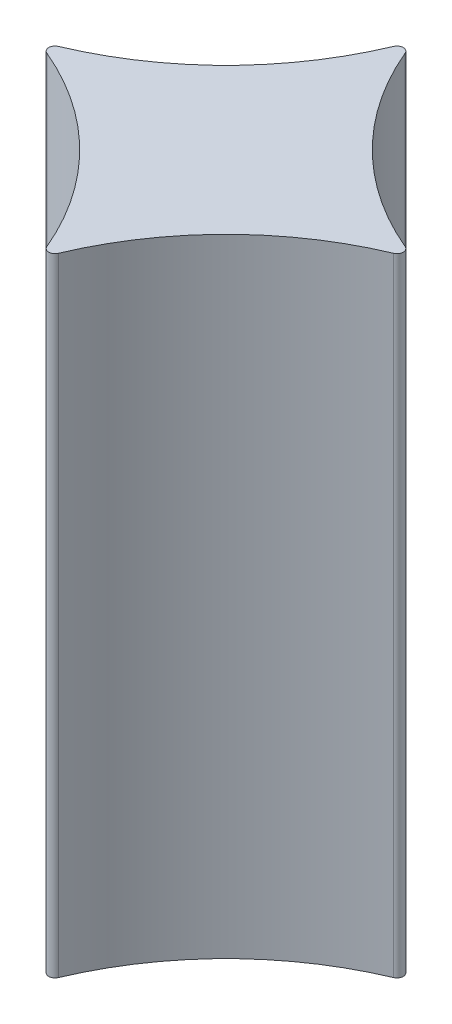
ISO-10303-21;
HEADER;
FILE_DESCRIPTION(('STEP AP214'),'2;1');
FILE_NAME('part.step','',(''),(''),'','','');
FILE_SCHEMA(('AUTOMOTIVE_DESIGN { 1 0 10303 214 1 1 1 1 }'));
ENDSEC;
DATA;
#1=APPLICATION_CONTEXT('core data for automotive mechanical design processes');
#2=APPLICATION_PROTOCOL_DEFINITION('international standard','automotive_design',2000,#1);
#3=PRODUCT_CONTEXT('',#1,'mechanical');
#4=PRODUCT('Part','Part','',(#3));
#5=PRODUCT_RELATED_PRODUCT_CATEGORY('part','',(#4));
#6=PRODUCT_DEFINITION_FORMATION('','',#4);
#7=PRODUCT_DEFINITION_CONTEXT('part definition',#1,'design');
#8=PRODUCT_DEFINITION('design','',#6,#7);
#9=PRODUCT_DEFINITION_SHAPE('','',#8);
#10=(LENGTH_UNIT() NAMED_UNIT(*) SI_UNIT(.MILLI.,.METRE.));
#11=(NAMED_UNIT(*) PLANE_ANGLE_UNIT() SI_UNIT($,.RADIAN.));
#12=(NAMED_UNIT(*) SI_UNIT($,.STERADIAN.) SOLID_ANGLE_UNIT());
#13=UNCERTAINTY_MEASURE_WITH_UNIT(LENGTH_MEASURE(1.E-05),#10,'distance_accuracy_value','');
#14=(GEOMETRIC_REPRESENTATION_CONTEXT(3) GLOBAL_UNCERTAINTY_ASSIGNED_CONTEXT((#13)) GLOBAL_UNIT_ASSIGNED_CONTEXT((#10,
#11,#12)) REPRESENTATION_CONTEXT('',''));
#15=CARTESIAN_POINT('',(0.,0.,0.));
#16=DIRECTION('',(0.,0.,1.));
#17=DIRECTION('',(1.,0.,0.));
#18=AXIS2_PLACEMENT_3D('',#15,#16,#17);
#19=CARTESIAN_POINT('',(2.72537547675906,10.,0.));
#20=DIRECTION('',(0.,-1.,0.));
#21=DIRECTION('',(0.,0.,-1.));
#22=AXIS2_PLACEMENT_3D('',#19,#20,#21);
#23=CYLINDRICAL_SURFACE('',#22,0.0999999999999999);
#24=CARTESIAN_POINT('',(2.72537547675906,0.,0.));
#25=DIRECTION('',(0.,1.,0.));
#26=DIRECTION('',(0.,0.,-1.));
#27=AXIS2_PLACEMENT_3D('',#24,#25,#26);
#28=CIRCLE('',#27,0.0999999999999999);
#29=CARTESIAN_POINT('',(2.7641242344445,0.,0.0921874925238529));
#30=VERTEX_POINT('',#29);
#31=CARTESIAN_POINT('',(2.76412423444449,0.,-0.0921874925238529));
#32=VERTEX_POINT('',#31);
#33=EDGE_CURVE('E140',#30,#32,#28,.T.);
#34=ORIENTED_EDGE('',*,*,#33,.T.);
#35=DIRECTION('',(0.,-1.,0.));
#36=VECTOR('',#35,1.);
#37=CARTESIAN_POINT('',(2.76412423444449,10.,-0.0921874925238529));
#38=LINE('',#37,#36);
#39=CARTESIAN_POINT('',(2.76412423444449,10.,-0.0921874925238529));
#40=VERTEX_POINT('',#39);
#41=EDGE_CURVE('E11',#40,#32,#38,.T.);
#42=ORIENTED_EDGE('',*,*,#41,.F.);
#43=CARTESIAN_POINT('',(2.72537547675906,10.,0.));
#44=DIRECTION('',(0.,1.,0.));
#45=DIRECTION('',(0.,0.,-1.));
#46=AXIS2_PLACEMENT_3D('',#43,#44,#45);
#47=CIRCLE('',#46,0.0999999999999999);
#48=CARTESIAN_POINT('',(2.7641242344445,10.,0.0921874925238529));
#49=VERTEX_POINT('',#48);
#50=EDGE_CURVE('E162',#49,#40,#47,.T.);
#51=ORIENTED_EDGE('',*,*,#50,.F.);
#52=DIRECTION('',(0.,-1.,0.));
#53=VECTOR('',#52,1.);
#54=CARTESIAN_POINT('',(2.7641242344445,10.,0.0921874925238529));
#55=LINE('',#54,#53);
#56=EDGE_CURVE('E136',#49,#30,#55,.T.);
#57=ORIENTED_EDGE('',*,*,#56,.T.);
#58=EDGE_LOOP('',(#34,#42,#51,#57));
#59=FACE_BOUND('',#58,.T.);
#60=ADVANCED_FACE('F39',(#59),#23,.T.);
#61=CARTESIAN_POINT('',(4.70156211871642,10.,-4.70156211871643));
#62=DIRECTION('',(0.,-1.,0.));
#63=DIRECTION('',(0.,0.,-1.));
#64=AXIS2_PLACEMENT_3D('',#61,#62,#63);
#65=CYLINDRICAL_SURFACE('',#64,5.);
#66=CARTESIAN_POINT('',(4.70156211871642,0.,-4.70156211871643));
#67=DIRECTION('',(0.,-1.,0.));
#68=DIRECTION('',(0.,0.,1.));
#69=AXIS2_PLACEMENT_3D('',#66,#67,#68);
#70=CIRCLE('',#69,5.);
#71=CARTESIAN_POINT('',(0.0921874925238512,0.,-2.7641242344445));
#72=VERTEX_POINT('',#71);
#73=EDGE_CURVE('E144',#32,#72,#70,.T.);
#74=ORIENTED_EDGE('',*,*,#73,.T.);
#75=DIRECTION('',(0.,-1.,0.));
#76=VECTOR('',#75,1.);
#77=CARTESIAN_POINT('',(0.0921874925238512,10.,-2.7641242344445));
#78=LINE('',#77,#76);
#79=CARTESIAN_POINT('',(0.0921874925238512,10.,-2.7641242344445));
#80=VERTEX_POINT('',#79);
#81=EDGE_CURVE('E48',#80,#72,#78,.T.);
#82=ORIENTED_EDGE('',*,*,#81,.F.);
#83=CARTESIAN_POINT('',(4.70156211871642,10.,-4.70156211871643));
#84=DIRECTION('',(0.,-1.,0.));
#85=DIRECTION('',(0.,0.,1.));
#86=AXIS2_PLACEMENT_3D('',#83,#84,#85);
#87=CIRCLE('',#86,5.);
#88=EDGE_CURVE('E99',#40,#80,#87,.T.);
#89=ORIENTED_EDGE('',*,*,#88,.F.);
#90=ORIENTED_EDGE('',*,*,#41,.T.);
#91=EDGE_LOOP('',(#74,#82,#89,#90));
#92=FACE_BOUND('',#91,.T.);
#93=ADVANCED_FACE('F208',(#92),#65,.F.);
#94=CARTESIAN_POINT('',(0.,10.,-2.72537547675906));
#95=DIRECTION('',(0.,-1.,0.));
#96=DIRECTION('',(0.,0.,-1.));
#97=AXIS2_PLACEMENT_3D('',#94,#95,#96);
#98=CYLINDRICAL_SURFACE('',#97,0.1);
#99=CARTESIAN_POINT('',(0.,0.,-2.72537547675906));
#100=DIRECTION('',(0.,1.,0.));
#101=DIRECTION('',(0.,0.,-1.));
#102=AXIS2_PLACEMENT_3D('',#99,#100,#101);
#103=CIRCLE('',#102,0.1);
#104=CARTESIAN_POINT('',(-0.0921874925238517,0.,-2.76412423444449));
#105=VERTEX_POINT('',#104);
#106=EDGE_CURVE('E147',#72,#105,#103,.T.);
#107=ORIENTED_EDGE('',*,*,#106,.T.);
#108=DIRECTION('',(0.,-1.,0.));
#109=VECTOR('',#108,1.);
#110=CARTESIAN_POINT('',(-0.0921874925238517,10.,-2.76412423444449));
#111=LINE('',#110,#109);
#112=CARTESIAN_POINT('',(-0.0921874925238517,10.,-2.76412423444449));
#113=VERTEX_POINT('',#112);
#114=EDGE_CURVE('E173',#113,#105,#111,.T.);
#115=ORIENTED_EDGE('',*,*,#114,.F.);
#116=CARTESIAN_POINT('',(0.,10.,-2.72537547675906));
#117=DIRECTION('',(0.,1.,0.));
#118=DIRECTION('',(0.,0.,-1.));
#119=AXIS2_PLACEMENT_3D('',#116,#117,#118);
#120=CIRCLE('',#119,0.1);
#121=EDGE_CURVE('E183',#80,#113,#120,.T.);
#122=ORIENTED_EDGE('',*,*,#121,.F.);
#123=ORIENTED_EDGE('',*,*,#81,.T.);
#124=EDGE_LOOP('',(#107,#115,#122,#123));
#125=FACE_BOUND('',#124,.T.);
#126=ADVANCED_FACE('F181',(#125),#98,.T.);
#127=CARTESIAN_POINT('',(-4.70156211871642,10.,-4.70156211871643));
#128=DIRECTION('',(0.,-1.,0.));
#129=DIRECTION('',(0.,0.,-1.));
#130=AXIS2_PLACEMENT_3D('',#127,#128,#129);
#131=CYLINDRICAL_SURFACE('',#130,5.);
#132=CARTESIAN_POINT('',(-4.70156211871642,0.,-4.70156211871643));
#133=DIRECTION('',(0.,-1.,0.));
#134=DIRECTION('',(0.,0.,-1.));
#135=AXIS2_PLACEMENT_3D('',#132,#133,#134);
#136=CIRCLE('',#135,5.);
#137=CARTESIAN_POINT('',(-2.7641242344445,0.,-0.0921874925238503));
#138=VERTEX_POINT('',#137);
#139=EDGE_CURVE('E150',#105,#138,#136,.T.);
#140=ORIENTED_EDGE('',*,*,#139,.T.);
#141=DIRECTION('',(0.,-1.,0.));
#142=VECTOR('',#141,1.);
#143=CARTESIAN_POINT('',(-2.7641242344445,10.,-0.0921874925238503));
#144=LINE('',#143,#142);
#145=CARTESIAN_POINT('',(-2.7641242344445,10.,-0.0921874925238503));
#146=VERTEX_POINT('',#145);
#147=EDGE_CURVE('E169',#146,#138,#144,.T.);
#148=ORIENTED_EDGE('',*,*,#147,.F.);
#149=CARTESIAN_POINT('',(-4.70156211871642,10.,-4.70156211871643));
#150=DIRECTION('',(0.,-1.,0.));
#151=DIRECTION('',(0.,0.,-1.));
#152=AXIS2_PLACEMENT_3D('',#149,#150,#151);
#153=CIRCLE('',#152,5.);
#154=EDGE_CURVE('E196',#113,#146,#153,.T.);
#155=ORIENTED_EDGE('',*,*,#154,.F.);
#156=ORIENTED_EDGE('',*,*,#114,.T.);
#157=EDGE_LOOP('',(#140,#148,#155,#156));
#158=FACE_BOUND('',#157,.T.);
#159=ADVANCED_FACE('F191',(#158),#131,.F.);
#160=CARTESIAN_POINT('',(-2.72537547675906,10.,0.));
#161=DIRECTION('',(0.,-1.,0.));
#162=DIRECTION('',(0.,0.,-1.));
#163=AXIS2_PLACEMENT_3D('',#160,#161,#162);
#164=CYLINDRICAL_SURFACE('',#163,0.0999999999999999);
#165=CARTESIAN_POINT('',(-2.72537547675906,0.,0.));
#166=DIRECTION('',(0.,1.,0.));
#167=DIRECTION('',(0.,0.,1.));
#168=AXIS2_PLACEMENT_3D('',#165,#166,#167);
#169=CIRCLE('',#168,0.0999999999999999);
#170=CARTESIAN_POINT('',(-2.7641242344445,0.,0.0921874925238513));
#171=VERTEX_POINT('',#170);
#172=EDGE_CURVE('E153',#138,#171,#169,.T.);
#173=ORIENTED_EDGE('',*,*,#172,.T.);
#174=DIRECTION('',(0.,-1.,0.));
#175=VECTOR('',#174,1.);
#176=CARTESIAN_POINT('',(-2.7641242344445,10.,0.0921874925238513));
#177=LINE('',#176,#175);
#178=CARTESIAN_POINT('',(-2.7641242344445,10.,0.0921874925238513));
#179=VERTEX_POINT('',#178);
#180=EDGE_CURVE('E129',#179,#171,#177,.T.);
#181=ORIENTED_EDGE('',*,*,#180,.F.);
#182=CARTESIAN_POINT('',(-2.72537547675906,10.,0.));
#183=DIRECTION('',(0.,1.,0.));
#184=DIRECTION('',(0.,0.,1.));
#185=AXIS2_PLACEMENT_3D('',#182,#183,#184);
#186=CIRCLE('',#185,0.0999999999999999);
#187=EDGE_CURVE('E118',#146,#179,#186,.T.);
#188=ORIENTED_EDGE('',*,*,#187,.F.);
#189=ORIENTED_EDGE('',*,*,#147,.T.);
#190=EDGE_LOOP('',(#173,#181,#188,#189));
#191=FACE_BOUND('',#190,.T.);
#192=ADVANCED_FACE('F194',(#191),#164,.T.);
#193=CARTESIAN_POINT('',(-4.70156211871642,10.,4.70156211871643));
#194=DIRECTION('',(0.,-1.,0.));
#195=DIRECTION('',(0.,0.,-1.));
#196=AXIS2_PLACEMENT_3D('',#193,#194,#195);
#197=CYLINDRICAL_SURFACE('',#196,5.);
#198=CARTESIAN_POINT('',(-4.70156211871642,0.,4.70156211871643));
#199=DIRECTION('',(0.,-1.,0.));
#200=DIRECTION('',(0.,0.,-1.));
#201=AXIS2_PLACEMENT_3D('',#198,#199,#200);
#202=CIRCLE('',#201,5.);
#203=CARTESIAN_POINT('',(-0.0921874925238512,0.,2.7641242344445));
#204=VERTEX_POINT('',#203);
#205=EDGE_CURVE('E127',#171,#204,#202,.T.);
#206=ORIENTED_EDGE('',*,*,#205,.T.);
#207=DIRECTION('',(0.,-1.,0.));
#208=VECTOR('',#207,1.);
#209=CARTESIAN_POINT('',(-0.0921874925238512,10.,2.7641242344445));
#210=LINE('',#209,#208);
#211=CARTESIAN_POINT('',(-0.0921874925238512,10.,2.7641242344445));
#212=VERTEX_POINT('',#211);
#213=EDGE_CURVE('E124',#212,#204,#210,.T.);
#214=ORIENTED_EDGE('',*,*,#213,.F.);
#215=CARTESIAN_POINT('',(-4.70156211871642,10.,4.70156211871643));
#216=DIRECTION('',(0.,-1.,0.));
#217=DIRECTION('',(0.,0.,-1.));
#218=AXIS2_PLACEMENT_3D('',#215,#216,#217);
#219=CIRCLE('',#218,5.);
#220=EDGE_CURVE('E112',#179,#212,#219,.T.);
#221=ORIENTED_EDGE('',*,*,#220,.F.);
#222=ORIENTED_EDGE('',*,*,#180,.T.);
#223=EDGE_LOOP('',(#206,#214,#221,#222));
#224=FACE_BOUND('',#223,.T.);
#225=ADVANCED_FACE('F125',(#224),#197,.F.);
#226=CARTESIAN_POINT('',(0.,10.,2.72537547675906));
#227=DIRECTION('',(0.,-1.,0.));
#228=DIRECTION('',(0.,0.,-1.));
#229=AXIS2_PLACEMENT_3D('',#226,#227,#228);
#230=CYLINDRICAL_SURFACE('',#229,0.1);
#231=CARTESIAN_POINT('',(0.,0.,2.72537547675906));
#232=DIRECTION('',(0.,1.,0.));
#233=DIRECTION('',(0.,0.,1.));
#234=AXIS2_PLACEMENT_3D('',#231,#232,#233);
#235=CIRCLE('',#234,0.1);
#236=CARTESIAN_POINT('',(0.0921874925238526,0.,2.7641242344445));
#237=VERTEX_POINT('',#236);
#238=EDGE_CURVE('E85',#204,#237,#235,.T.);
#239=ORIENTED_EDGE('',*,*,#238,.T.);
#240=DIRECTION('',(0.,-1.,0.));
#241=VECTOR('',#240,1.);
#242=CARTESIAN_POINT('',(0.0921874925238526,10.,2.7641242344445));
#243=LINE('',#242,#241);
#244=CARTESIAN_POINT('',(0.0921874925238526,10.,2.7641242344445));
#245=VERTEX_POINT('',#244);
#246=EDGE_CURVE('E130',#245,#237,#243,.T.);
#247=ORIENTED_EDGE('',*,*,#246,.F.);
#248=CARTESIAN_POINT('',(0.,10.,2.72537547675906));
#249=DIRECTION('',(0.,1.,0.));
#250=DIRECTION('',(0.,0.,1.));
#251=AXIS2_PLACEMENT_3D('',#248,#249,#250);
#252=CIRCLE('',#251,0.1);
#253=EDGE_CURVE('E116',#212,#245,#252,.T.);
#254=ORIENTED_EDGE('',*,*,#253,.F.);
#255=ORIENTED_EDGE('',*,*,#213,.T.);
#256=EDGE_LOOP('',(#239,#247,#254,#255));
#257=FACE_BOUND('',#256,.T.);
#258=ADVANCED_FACE('F132',(#257),#230,.T.);
#259=CARTESIAN_POINT('',(4.70156211871643,10.,4.70156211871642));
#260=DIRECTION('',(0.,-1.,0.));
#261=DIRECTION('',(0.,0.,-1.));
#262=AXIS2_PLACEMENT_3D('',#259,#260,#261);
#263=CYLINDRICAL_SURFACE('',#262,5.);
#264=CARTESIAN_POINT('',(4.70156211871643,0.,4.70156211871642));
#265=DIRECTION('',(0.,-1.,0.));
#266=DIRECTION('',(0.,0.,-1.));
#267=AXIS2_PLACEMENT_3D('',#264,#265,#266);
#268=CIRCLE('',#267,5.);
#269=EDGE_CURVE('E91',#237,#30,#268,.T.);
#270=ORIENTED_EDGE('',*,*,#269,.T.);
#271=ORIENTED_EDGE('',*,*,#56,.F.);
#272=CARTESIAN_POINT('',(4.70156211871643,10.,4.70156211871642));
#273=DIRECTION('',(0.,-1.,0.));
#274=DIRECTION('',(0.,0.,-1.));
#275=AXIS2_PLACEMENT_3D('',#272,#273,#274);
#276=CIRCLE('',#275,5.);
#277=EDGE_CURVE('E56',#245,#49,#276,.T.);
#278=ORIENTED_EDGE('',*,*,#277,.F.);
#279=ORIENTED_EDGE('',*,*,#246,.T.);
#280=EDGE_LOOP('',(#270,#271,#278,#279));
#281=FACE_BOUND('',#280,.T.);
#282=ADVANCED_FACE('F224',(#281),#263,.F.);
#283=CARTESIAN_POINT('',(3.71346879773774,10.,2.35078105935821));
#284=DIRECTION('',(0.,-1.,0.));
#285=DIRECTION('',(0.,0.,-1.));
#286=AXIS2_PLACEMENT_3D('',#283,#284,#285);
#287=PLANE('',#286);
#288=ORIENTED_EDGE('',*,*,#50,.T.);
#289=ORIENTED_EDGE('',*,*,#88,.T.);
#290=ORIENTED_EDGE('',*,*,#121,.T.);
#291=ORIENTED_EDGE('',*,*,#154,.T.);
#292=ORIENTED_EDGE('',*,*,#187,.T.);
#293=ORIENTED_EDGE('',*,*,#220,.T.);
#294=ORIENTED_EDGE('',*,*,#253,.T.);
#295=ORIENTED_EDGE('',*,*,#277,.T.);
#296=EDGE_LOOP('',(#288,#289,#290,#291,#292,#293,#294,#295));
#297=FACE_BOUND('',#296,.T.);
#298=ADVANCED_FACE('F114',(#297),#287,.F.);
#299=CARTESIAN_POINT('',(3.71346879773774,0.,2.35078105935821));
#300=DIRECTION('',(0.,-1.,0.));
#301=DIRECTION('',(0.,0.,-1.));
#302=AXIS2_PLACEMENT_3D('',#299,#300,#301);
#303=PLANE('',#302);
#304=ORIENTED_EDGE('',*,*,#33,.F.);
#305=ORIENTED_EDGE('',*,*,#269,.F.);
#306=ORIENTED_EDGE('',*,*,#238,.F.);
#307=ORIENTED_EDGE('',*,*,#205,.F.);
#308=ORIENTED_EDGE('',*,*,#172,.F.);
#309=ORIENTED_EDGE('',*,*,#139,.F.);
#310=ORIENTED_EDGE('',*,*,#106,.F.);
#311=ORIENTED_EDGE('',*,*,#73,.F.);
#312=EDGE_LOOP('',(#304,#305,#306,#307,#308,#309,#310,#311));
#313=FACE_BOUND('',#312,.T.);
#314=ADVANCED_FACE('F187',(#313),#303,.T.);
#315=CLOSED_SHELL('',(#60,#93,#126,#159,#192,#225,#258,#282,#298,#314));
#316=MANIFOLD_SOLID_BREP('B2',#315);
#317=ADVANCED_BREP_SHAPE_REPRESENTATION('',(#18,#316),#14);
#318=SHAPE_DEFINITION_REPRESENTATION(#9,#317);
ENDSEC;
END-ISO-10303-21;
